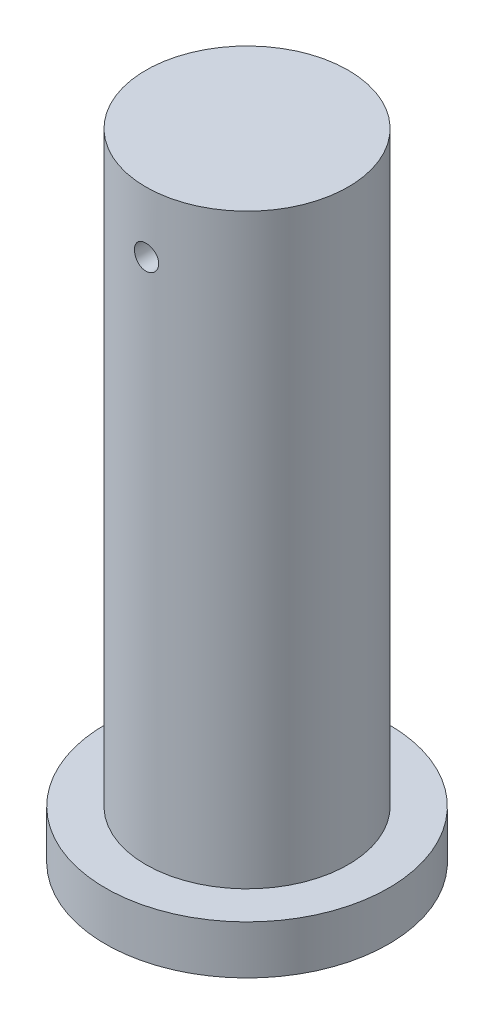
ISO-10303-21;
HEADER;
FILE_DESCRIPTION(('STEP AP214'),'2;1');
FILE_NAME('part.step','',(''),(''),'','','');
FILE_SCHEMA(('AUTOMOTIVE_DESIGN { 1 0 10303 214 1 1 1 1 }'));
ENDSEC;
DATA;
#1=APPLICATION_CONTEXT('core data for automotive mechanical design processes');
#2=APPLICATION_PROTOCOL_DEFINITION('international standard','automotive_design',2000,#1);
#3=PRODUCT_CONTEXT('',#1,'mechanical');
#4=PRODUCT('Part','Part','',(#3));
#5=PRODUCT_RELATED_PRODUCT_CATEGORY('part','',(#4));
#6=PRODUCT_DEFINITION_FORMATION('','',#4);
#7=PRODUCT_DEFINITION_CONTEXT('part definition',#1,'design');
#8=PRODUCT_DEFINITION('design','',#6,#7);
#9=PRODUCT_DEFINITION_SHAPE('','',#8);
#10=(LENGTH_UNIT() NAMED_UNIT(*) SI_UNIT(.MILLI.,.METRE.));
#11=(NAMED_UNIT(*) PLANE_ANGLE_UNIT() SI_UNIT($,.RADIAN.));
#12=(NAMED_UNIT(*) SI_UNIT($,.STERADIAN.) SOLID_ANGLE_UNIT());
#13=UNCERTAINTY_MEASURE_WITH_UNIT(LENGTH_MEASURE(1.E-05),#10,'distance_accuracy_value','');
#14=(GEOMETRIC_REPRESENTATION_CONTEXT(3) GLOBAL_UNCERTAINTY_ASSIGNED_CONTEXT((#13)) GLOBAL_UNIT_ASSIGNED_CONTEXT((#10,
#11,#12)) REPRESENTATION_CONTEXT('',''));
#15=CARTESIAN_POINT('',(0.,0.,0.));
#16=DIRECTION('',(0.,0.,1.));
#17=DIRECTION('',(1.,0.,0.));
#18=AXIS2_PLACEMENT_3D('',#15,#16,#17);
#19=CARTESIAN_POINT('',(0.,0.,0.));
#20=DIRECTION('',(0.,-1.,0.));
#21=DIRECTION('',(0.,0.,-1.));
#22=AXIS2_PLACEMENT_3D('',#19,#20,#21);
#23=PLANE('',#22);
#24=CARTESIAN_POINT('',(0.,0.,0.));
#25=DIRECTION('',(0.,-1.,0.));
#26=DIRECTION('',(0.,0.,-1.));
#27=AXIS2_PLACEMENT_3D('',#24,#25,#26);
#28=CIRCLE('',#27,25.);
#29=CARTESIAN_POINT('',(0.,0.,-25.));
#30=VERTEX_POINT('',#29);
#31=EDGE_CURVE('E10',#30,#30,#28,.T.);
#32=ORIENTED_EDGE('',*,*,#31,.F.);
#33=EDGE_LOOP('',(#32));
#34=FACE_BOUND('',#33,.T.);
#35=ADVANCED_FACE('F43',(#34),#23,.F.);
#36=CARTESIAN_POINT('',(0.,-157.,0.));
#37=DIRECTION('',(0.,-1.,0.));
#38=DIRECTION('',(0.,0.,-1.));
#39=AXIS2_PLACEMENT_3D('',#36,#37,#38);
#40=CYLINDRICAL_SURFACE('',#39,25.);
#41=CARTESIAN_POINT('',(0.,-12.,-25.));
#42=CARTESIAN_POINT('',(-0.1678640471077,-12.0000071639414,-24.9999977357459));
#43=CARTESIAN_POINT('',(-0.335834317331192,-12.0141366586927,-24.9982914200408));
#44=CARTESIAN_POINT('',(-0.66710457130825,-12.0702810641554,-24.991648705422));
#45=CARTESIAN_POINT('',(-0.830399429590069,-12.1123254412506,-24.9867088933728));
#46=CARTESIAN_POINT('',(-1.14747479534053,-12.223046276526,-24.9741559265426));
#47=CARTESIAN_POINT('',(-1.30126148759225,-12.2917052068242,-24.9665445315309));
#48=CARTESIAN_POINT('',(-1.595099157832,-12.4536687350833,-24.9494959264345));
#49=CARTESIAN_POINT('',(-1.73515256713516,-12.5469689597533,-24.9400590404141));
#50=CARTESIAN_POINT('',(-1.99829131534451,-12.7560748619752,-24.920360105442));
#51=CARTESIAN_POINT('',(-2.1212966913072,-12.8719808401119,-24.9100945030904));
#52=CARTESIAN_POINT('',(-2.34615931038342,-13.1227929648879,-24.8899239397152));
#53=CARTESIAN_POINT('',(-2.44801549826474,-13.2577000590186,-24.8800189967068));
#54=CARTESIAN_POINT('',(-2.62798342873896,-13.5432008252984,-24.8616560370404));
#55=CARTESIAN_POINT('',(-2.7060207567257,-13.6938417245801,-24.8532025903971));
#56=CARTESIAN_POINT('',(-2.8356605730156,-14.0062087021087,-24.8387461344686));
#57=CARTESIAN_POINT('',(-2.88726398696776,-14.1679343919693,-24.8327430393798));
#58=CARTESIAN_POINT('',(-2.962329300454,-14.4970528593114,-24.8239006073737));
#59=CARTESIAN_POINT('',(-2.98592577987646,-14.6644145284277,-24.8210461452543));
#60=CARTESIAN_POINT('',(-3.0047237521967,-15.0007449363642,-24.8187777690611));
#61=CARTESIAN_POINT('',(-2.99992630052848,-15.169713615217,-24.8193637271032));
#62=CARTESIAN_POINT('',(-2.96218316078668,-15.5035259647843,-24.8238961466306));
#63=CARTESIAN_POINT('',(-2.92938543222303,-15.6683866386802,-24.8278249434675));
#64=CARTESIAN_POINT('',(-2.83680346170067,-15.9902470278213,-24.8385728087608));
#65=CARTESIAN_POINT('',(-2.77701871225814,-16.147246595179,-24.8453919315687));
#66=CARTESIAN_POINT('',(-2.63199980699862,-16.4493894682391,-24.8611722079476));
#67=CARTESIAN_POINT('',(-2.54670106203925,-16.5945014783535,-24.8701387862198));
#68=CARTESIAN_POINT('',(-2.35312173169469,-16.8684072109158,-24.8891993987901));
#69=CARTESIAN_POINT('',(-2.24484017723157,-16.9972002449026,-24.8992934806213));
#70=CARTESIAN_POINT('',(-2.0075475556218,-17.2356710843644,-24.9195503308637));
#71=CARTESIAN_POINT('',(-1.87840890051216,-17.345221969857,-24.929713127424));
#72=CARTESIAN_POINT('',(-1.60350795893872,-17.5411115210003,-24.9489020798549));
#73=CARTESIAN_POINT('',(-1.45774563908005,-17.6274501400191,-24.9579282334421));
#74=CARTESIAN_POINT('',(-1.15363930826284,-17.7744632856396,-24.9738318861702));
#75=CARTESIAN_POINT('',(-0.995291578715591,-17.8351301933304,-24.9807087472809));
#76=CARTESIAN_POINT('',(-0.67055602227344,-17.9289787378509,-24.991533065309));
#77=CARTESIAN_POINT('',(-0.504168542441624,-17.9621615600045,-24.9954806485584));
#78=CARTESIAN_POINT('',(-0.169174396374218,-17.9999362554977,-24.9999852500304));
#79=CARTESIAN_POINT('',(-0.000587720432052556,-18.0047030324007,-25.0005630093753));
#80=CARTESIAN_POINT('',(0.334982068243259,-17.9859714221317,-24.9983187823231));
#81=CARTESIAN_POINT('',(0.501965212327328,-17.9624735887046,-24.9954968625308));
#82=CARTESIAN_POINT('',(0.829074263928356,-17.8880250359969,-24.9867833380686));
#83=CARTESIAN_POINT('',(0.989219346369034,-17.8371573869499,-24.9809010237909));
#84=CARTESIAN_POINT('',(1.29870539768646,-17.7094992966464,-24.9667255501792));
#85=CARTESIAN_POINT('',(1.44804602592347,-17.6327080385099,-24.9584323148759));
#86=CARTESIAN_POINT('',(1.73246717766504,-17.4549570840976,-24.9403085158695));
#87=CARTESIAN_POINT('',(1.86747628962751,-17.3538838621892,-24.9304708084643));
#88=CARTESIAN_POINT('',(2.11867625152204,-17.1305991535918,-24.9103817919419));
#89=CARTESIAN_POINT('',(2.23486641472949,-17.008386895852,-24.9001304677484));
#90=CARTESIAN_POINT('',(2.44574795226154,-16.7455243845723,-24.8803059484942));
#91=CARTESIAN_POINT('',(2.54032363231939,-16.6047809846561,-24.8707365831307));
#92=CARTESIAN_POINT('',(2.70449314429332,-16.3093049749244,-24.8534214993383));
#93=CARTESIAN_POINT('',(2.77408744356074,-16.1545726268817,-24.8456757467942));
#94=CARTESIAN_POINT('',(2.88612996668159,-15.8358893911053,-24.8329105734502));
#95=CARTESIAN_POINT('',(2.92864420159346,-15.6719619881406,-24.8278845275633));
#96=CARTESIAN_POINT('',(2.98553272163517,-15.3392310305149,-24.8211085274587));
#97=CARTESIAN_POINT('',(2.99990820526081,-15.1704276838427,-24.8193584337106));
#98=CARTESIAN_POINT('',(3.00009033817931,-14.8338872703628,-24.8193363266069));
#99=CARTESIAN_POINT('',(2.98607873671351,-14.6661502742287,-24.8210421863943));
#100=CARTESIAN_POINT('',(2.93026848672089,-14.3354332136058,-24.8276922947425));
#101=CARTESIAN_POINT('',(2.88846982822067,-14.1724531508244,-24.8326365444656));
#102=CARTESIAN_POINT('',(2.77832739820545,-13.8558954611113,-24.8451996524586));
#103=CARTESIAN_POINT('',(2.70999165570539,-13.7023150065045,-24.8528177016812));
#104=CARTESIAN_POINT('',(2.5487328262801,-13.4087722529299,-24.8698714539138));
#105=CARTESIAN_POINT('',(2.45580952709445,-13.2688100715407,-24.8793071726153));
#106=CARTESIAN_POINT('',(2.24733689647205,-13.0055470598911,-24.8990055122587));
#107=CARTESIAN_POINT('',(2.1316520393015,-12.8823538967337,-24.9092728581347));
#108=CARTESIAN_POINT('',(1.88122093334448,-12.657057520434,-24.9294354968169));
#109=CARTESIAN_POINT('',(1.74647018263601,-12.5549593023708,-24.939330701051));
#110=CARTESIAN_POINT('',(1.46119322465137,-12.3744494220011,-24.9576721709324));
#111=CARTESIAN_POINT('',(1.31061323462418,-12.2961222742777,-24.966113221621));
#112=CARTESIAN_POINT('',(0.998422751685312,-12.1659762355574,-24.9805418519726));
#113=CARTESIAN_POINT('',(0.836824564362145,-12.1141283038196,-24.9865321180615));
#114=CARTESIAN_POINT('',(0.561977101236698,-12.0509365796619,-24.9939268325999));
#115=CARTESIAN_POINT('',(0.450466569753488,-12.0318625161136,-24.996193279433));
#116=CARTESIAN_POINT('',(0.225986735693695,-12.006391856509,-24.9992306204204));
#117=CARTESIAN_POINT('',(0.113017442753626,-11.9999951767495,-25.0000015244492));
#118=CARTESIAN_POINT('',(0.,-12.,-25.));
#119=B_SPLINE_CURVE_WITH_KNOTS('',3,(#41,#42,#43,#44,#45,#46,#47,#48,#49,#50,#51,#52,#53,#54,
#55,#56,#57,#58,#59,#60,#61,#62,#63,#64,#65,#66,#67,#68,#69,#70,#71,#72,#73,#74,#75,#76,#77,#78,
#79,#80,#81,#82,#83,#84,#85,#86,#87,#88,#89,#90,#91,#92,#93,#94,#95,#96,#97,#98,#99,#100,#101,
#102,#103,#104,#105,#106,#107,#108,#109,#110,#111,#112,#113,#114,#115,#116,#117,#118),
.UNSPECIFIED.,.T.,.F.,(4,2,2,2,2,2,2,2,2,2,2,2,2,2,2,2,2,2,2,2,2,2,2,2,2,2,2,2,2,2,2,2,2,2,2,2,
2,2,4),(0.,0.50317935095616,1.00689069408623,1.5102708637556,2.01356175441693,2.51913872195878,
3.02474090904883,3.53190689496397,4.03905511999114,4.54375638343279,5.0484388866848,
5.55047092912253,6.05251241253396,6.55583573710536,7.05918028869262,7.56572944640317,
8.07227962172601,8.57898002694279,9.08565857822619,9.58921522624227,10.0927620090108,
10.5947890255775,11.0968318630167,11.6012692178556,12.1057249760357,12.6128207581672,
13.119907053063,13.6257524826489,14.1315763666154,14.6341719319229,15.1367676776234,
15.6392114771388,16.1416596143122,16.6471952402032,17.1528504352009,17.6602829023946,
18.1671576479275,18.5059342945627,18.8447087043981),.UNSPECIFIED.);
#120=CARTESIAN_POINT('',(0.,-12.,-25.));
#121=VERTEX_POINT('',#120);
#122=EDGE_CURVE('E46',#121,#121,#119,.T.);
#123=ORIENTED_EDGE('',*,*,#122,.T.);
#124=EDGE_LOOP('',(#123));
#125=FACE_BOUND('',#124,.T.);
#126=CARTESIAN_POINT('',(3.,-15.,24.8193472919817));
#127=CARTESIAN_POINT('',(2.99999283172714,-15.1678591411999,24.819349617552));
#128=CARTESIAN_POINT('',(2.98586413495824,-15.3358245201498,24.8210685774632));
#129=CARTESIAN_POINT('',(2.92972318709126,-15.6670846120579,24.8277564496115));
#130=CARTESIAN_POINT('',(2.88768145238964,-15.8303741956862,24.8327287982131));
#131=CARTESIAN_POINT('',(2.77696834616031,-16.1474384055045,24.8453523109071));
#132=CARTESIAN_POINT('',(2.708314627898,-16.3012192611337,24.8530016988387));
#133=CARTESIAN_POINT('',(2.5463633755789,-16.5950471421034,24.8701152498661));
#134=CARTESIAN_POINT('',(2.45307020212001,-16.7350965915686,24.8795790917656));
#135=CARTESIAN_POINT('',(2.24397143930053,-16.9982397716095,24.8993100054925));
#136=CARTESIAN_POINT('',(2.1280639725065,-17.1212522943484,24.9095805816582));
#137=CARTESIAN_POINT('',(1.87724586434875,-17.3461287181621,24.9297361585383));
#138=CARTESIAN_POINT('',(1.74233429505413,-17.4479915859418,24.9396211403948));
#139=CARTESIAN_POINT('',(1.45682956846799,-17.6279665329362,24.9579274023081));
#140=CARTESIAN_POINT('',(1.30618995384899,-17.7060054157396,24.9663441380671));
#141=CARTESIAN_POINT('',(0.993825767272775,-17.8356484603847,24.9807271243236));
#142=CARTESIAN_POINT('',(0.832101576085542,-17.8872535297477,24.9866934589465));
#143=CARTESIAN_POINT('',(0.502987856985085,-17.9623222561034,24.9954787324527));
#144=CARTESIAN_POINT('',(0.335629471043381,-17.9859206534458,24.9983127364408));
#145=CARTESIAN_POINT('',(-0.000694496668563133,-18.0047235993105,25.0005654366101));
#146=CARTESIAN_POINT('',(-0.169660019668337,-17.9999291821582,24.9999842572034));
#147=CARTESIAN_POINT('',(-0.503485667517527,-17.9621908781486,24.9954842925266));
#148=CARTESIAN_POINT('',(-0.668362437568211,-17.9293918950276,24.9915826884338));
#149=CARTESIAN_POINT('',(-0.990254370091175,-17.836801848284,24.9808996422381));
#150=CARTESIAN_POINT('',(-1.1472693930426,-17.7770103058183,24.9741181490466));
#151=CARTESIAN_POINT('',(-1.44943112325937,-17.6319772710935,24.9584077904553));
#152=CARTESIAN_POINT('',(-1.59454729727538,-17.5466727639936,24.9494736188692));
#153=CARTESIAN_POINT('',(-1.86845892019878,-17.3530811010438,24.9304580967161));
#154=CARTESIAN_POINT('',(-1.99725367876689,-17.2447929735844,24.9203766976596));
#155=CARTESIAN_POINT('',(-2.23571721123049,-17.0074956504595,24.9001206745296));
#156=CARTESIAN_POINT('',(-2.34526038878379,-16.8783602186265,24.8899458632542));
#157=CARTESIAN_POINT('',(-2.54113591825157,-16.6034684863205,24.8707126046074));
#158=CARTESIAN_POINT('',(-2.62746820730526,-16.4577121408355,24.8616541602595));
#159=CARTESIAN_POINT('',(-2.77447678358649,-16.1536075098526,24.8456792055215));
#160=CARTESIAN_POINT('',(-2.83514351157641,-15.9952545587421,24.8387634934567));
#161=CARTESIAN_POINT('',(-2.92899010032378,-15.6705076404988,24.8278728306611));
#162=CARTESIAN_POINT('',(-2.96217117858551,-15.5041140298807,24.8238977496731));
#163=CARTESIAN_POINT('',(-2.99993928712165,-15.1691169036233,24.8193620015637));
#164=CARTESIAN_POINT('',(-3.00470284270772,-15.0005335641189,24.8187802560634));
#165=CARTESIAN_POINT('',(-2.98596598055603,-14.6649712191571,24.8210413301146));
#166=CARTESIAN_POINT('',(-2.96246611691249,-14.4979921823126,24.82388408253));
#167=CARTESIAN_POINT('',(-2.88801791942018,-14.170904216402,24.8326546274978));
#168=CARTESIAN_POINT('',(-2.83715462498938,-14.0107756531907,24.8385728602158));
#169=CARTESIAN_POINT('',(-2.70951076792624,-13.701320717024,24.8528197853248));
#170=CARTESIAN_POINT('',(-2.63272936258612,-13.5519946954969,24.8611485560914));
#171=CARTESIAN_POINT('',(-2.45499302721611,-13.2675837050254,24.8793287313299));
#172=CARTESIAN_POINT('',(-2.35392207141476,-13.1325717131187,24.8891873609855));
#173=CARTESIAN_POINT('',(-2.13064017836707,-12.8813648869882,24.9092935540369));
#174=CARTESIAN_POINT('',(-2.00842848443621,-12.7651707265941,24.9195411313438));
#175=CARTESIAN_POINT('',(-1.74556427266772,-12.5542802527651,24.939335094491));
#176=CARTESIAN_POINT('',(-1.60481849941784,-12.4596997534886,24.9488775256031));
#177=CARTESIAN_POINT('',(-1.30933642941058,-12.2955217906709,24.966127243116));
#178=CARTESIAN_POINT('',(-1.15460039564442,-12.2259238576255,24.9738345640038));
#179=CARTESIAN_POINT('',(-0.83591924471999,-12.1138789951242,24.9865280430514));
#180=CARTESIAN_POINT('',(-0.671998170647186,-12.0713644801157,24.9915209702628));
#181=CARTESIAN_POINT('',(-0.33928058499148,-12.0144732564178,24.9982511364507));
#182=CARTESIAN_POINT('',(-0.170484275461262,-12.0000953833069,24.9999885101567));
#183=CARTESIAN_POINT('',(0.166060006255654,-11.9999061558877,25.0000113048646));
#184=CARTESIAN_POINT('',(0.333807904658861,-12.0139159633167,24.9983183365244));
#185=CARTESIAN_POINT('',(0.664547224796241,-12.0697264549025,24.9917135402075));
#186=CARTESIAN_POINT('',(0.827538648089517,-12.1115271299496,24.9868017132859));
#187=CARTESIAN_POINT('',(1.14411955598358,-12.2216780151315,24.9743088019473));
#188=CARTESIAN_POINT('',(1.29771180874788,-12.2900203644542,24.9667285079088));
#189=CARTESIAN_POINT('',(1.59127541052543,-12.4512960695846,24.9497392443223));
#190=CARTESIAN_POINT('',(1.73124664929415,-12.5442296244038,24.9403302599753));
#191=CARTESIAN_POINT('',(1.99450948424813,-12.7527136820053,24.920663936203));
#192=CARTESIAN_POINT('',(2.11769526787512,-12.8683973553221,24.910401817522));
#193=CARTESIAN_POINT('',(2.34297730712577,-13.118823037156,24.8902246865463));
#194=CARTESIAN_POINT('',(2.44506854813714,-13.2535695645149,24.88030975725));
#195=CARTESIAN_POINT('',(2.62557074728252,-13.538842936159,24.8619119204259));
#196=CARTESIAN_POINT('',(2.70389598198192,-13.6894243282266,24.8534342444192));
#197=CARTESIAN_POINT('',(2.8340380582164,-14.001617753704,24.8389322365013));
#198=CARTESIAN_POINT('',(2.88588396425552,-14.1632174711855,24.8329052161653));
#199=CARTESIAN_POINT('',(2.94907010073915,-14.4380595391116,24.8254627238532));
#200=CARTESIAN_POINT('',(2.96814164942006,-14.5495627519622,24.8231807309863));
#201=CARTESIAN_POINT('',(2.99360896909453,-14.7740279321319,24.8201222373143));
#202=CARTESIAN_POINT('',(3.00000482599459,-14.8869898895593,24.8193457263061));
#203=CARTESIAN_POINT('',(3.,-15.,24.8193472919817));
#204=B_SPLINE_CURVE_WITH_KNOTS('',3,(#126,#127,#128,#129,#130,#131,#132,#133,#134,#135,#136,
#137,#138,#139,#140,#141,#142,#143,#144,#145,#146,#147,#148,#149,#150,#151,#152,#153,#154,#155,
#156,#157,#158,#159,#160,#161,#162,#163,#164,#165,#166,#167,#168,#169,#170,#171,#172,#173,#174,
#175,#176,#177,#178,#179,#180,#181,#182,#183,#184,#185,#186,#187,#188,#189,#190,#191,#192,#193,
#194,#195,#196,#197,#198,#199,#200,#201,#202,#203),.UNSPECIFIED.,.T.,.F.,(4,2,2,2,2,2,2,2,2,2,2,
2,2,2,2,2,2,2,2,2,2,2,2,2,2,2,2,2,2,2,2,2,2,2,2,2,2,2,4),(0.,0.503164613232923,1.00686154966524,
1.51022492507114,2.01349927674882,2.51909553323416,3.02471648549883,3.53187561756201,
4.03901733675556,4.54370917218766,5.04838262225285,5.5504604616135,6.05254720809333,
6.55588445357933,7.05924298138499,7.56577244411506,8.07230327863779,8.5790226067925,
9.08571948810824,9.58926554088958,10.0928017219916,10.5947819896887,11.0967785804672,
11.6012225031328,12.105684484956,12.6127892929794,13.119884570345,13.6257094034364,
14.1315133027652,14.6341406188081,15.1367677700954,15.6392461723566,16.1417286411941,
16.6472450412647,17.1528814752089,17.6603206216507,18.1672015841626,18.5059562893408,
18.8447086986815),.UNSPECIFIED.);
#205=CARTESIAN_POINT('',(3.,-15.,24.8193472919817));
#206=VERTEX_POINT('',#205);
#207=EDGE_CURVE('E64',#206,#206,#204,.T.);
#208=ORIENTED_EDGE('',*,*,#207,.T.);
#209=EDGE_LOOP('',(#208));
#210=FACE_BOUND('',#209,.T.);
#211=CARTESIAN_POINT('',(0.,-145.,0.));
#212=DIRECTION('',(0.,-1.,0.));
#213=DIRECTION('',(0.,0.,-1.));
#214=AXIS2_PLACEMENT_3D('',#211,#212,#213);
#215=CIRCLE('',#214,25.);
#216=CARTESIAN_POINT('',(0.,-145.,-25.));
#217=VERTEX_POINT('',#216);
#218=EDGE_CURVE('E55',#217,#217,#215,.T.);
#219=ORIENTED_EDGE('',*,*,#218,.F.);
#220=EDGE_LOOP('',(#219));
#221=FACE_BOUND('',#220,.T.);
#222=ORIENTED_EDGE('',*,*,#31,.T.);
#223=EDGE_LOOP('',(#222));
#224=FACE_BOUND('',#223,.T.);
#225=ADVANCED_FACE('F70',(#125,#210,#221,#224),#40,.T.);
#226=CARTESIAN_POINT('',(0.,-145.,25.));
#227=DIRECTION('',(0.,-1.,0.));
#228=DIRECTION('',(0.,0.,-1.));
#229=AXIS2_PLACEMENT_3D('',#226,#227,#228);
#230=PLANE('',#229);
#231=CARTESIAN_POINT('',(0.,-145.,0.));
#232=DIRECTION('',(0.,-1.,0.));
#233=DIRECTION('',(0.,0.,-1.));
#234=AXIS2_PLACEMENT_3D('',#231,#232,#233);
#235=CIRCLE('',#234,35.);
#236=CARTESIAN_POINT('',(0.,-145.,-35.));
#237=VERTEX_POINT('',#236);
#238=EDGE_CURVE('E61',#237,#237,#235,.T.);
#239=ORIENTED_EDGE('',*,*,#238,.F.);
#240=EDGE_LOOP('',(#239));
#241=FACE_BOUND('',#240,.T.);
#242=ORIENTED_EDGE('',*,*,#218,.T.);
#243=EDGE_LOOP('',(#242));
#244=FACE_BOUND('',#243,.T.);
#245=ADVANCED_FACE('F85',(#241,#244),#230,.F.);
#246=CARTESIAN_POINT('',(0.,-157.,0.));
#247=DIRECTION('',(0.,-1.,0.));
#248=DIRECTION('',(0.,0.,-1.));
#249=AXIS2_PLACEMENT_3D('',#246,#247,#248);
#250=CYLINDRICAL_SURFACE('',#249,35.);
#251=CARTESIAN_POINT('',(0.,-157.,0.));
#252=DIRECTION('',(0.,-1.,0.));
#253=DIRECTION('',(0.,0.,-1.));
#254=AXIS2_PLACEMENT_3D('',#251,#252,#253);
#255=CIRCLE('',#254,35.);
#256=CARTESIAN_POINT('',(0.,-157.,-35.));
#257=VERTEX_POINT('',#256);
#258=EDGE_CURVE('E136',#257,#257,#255,.T.);
#259=ORIENTED_EDGE('',*,*,#258,.F.);
#260=EDGE_LOOP('',(#259));
#261=FACE_BOUND('',#260,.T.);
#262=ORIENTED_EDGE('',*,*,#238,.T.);
#263=EDGE_LOOP('',(#262));
#264=FACE_BOUND('',#263,.T.);
#265=ADVANCED_FACE('F82',(#261,#264),#250,.T.);
#266=CARTESIAN_POINT('',(0.,-157.,35.));
#267=DIRECTION('',(0.,1.,0.));
#268=DIRECTION('',(0.,0.,1.));
#269=AXIS2_PLACEMENT_3D('',#266,#267,#268);
#270=PLANE('',#269);
#271=ORIENTED_EDGE('',*,*,#258,.T.);
#272=EDGE_LOOP('',(#271));
#273=FACE_BOUND('',#272,.T.);
#274=ADVANCED_FACE('F77',(#273),#270,.F.);
#275=CARTESIAN_POINT('',(0.,-15.,-35.));
#276=DIRECTION('',(0.,0.,1.));
#277=DIRECTION('',(1.,0.,0.));
#278=AXIS2_PLACEMENT_3D('',#275,#276,#277);
#279=CYLINDRICAL_SURFACE('',#278,3.);
#280=ORIENTED_EDGE('',*,*,#207,.F.);
#281=EDGE_LOOP('',(#280));
#282=FACE_BOUND('',#281,.T.);
#283=ORIENTED_EDGE('',*,*,#122,.F.);
#284=EDGE_LOOP('',(#283));
#285=FACE_BOUND('',#284,.T.);
#286=ADVANCED_FACE('F73',(#282,#285),#279,.F.);
#287=CLOSED_SHELL('',(#35,#225,#245,#265,#274,#286));
#288=MANIFOLD_SOLID_BREP('B2',#287);
#289=ADVANCED_BREP_SHAPE_REPRESENTATION('',(#18,#288),#14);
#290=SHAPE_DEFINITION_REPRESENTATION(#9,#289);
ENDSEC;
END-ISO-10303-21;
